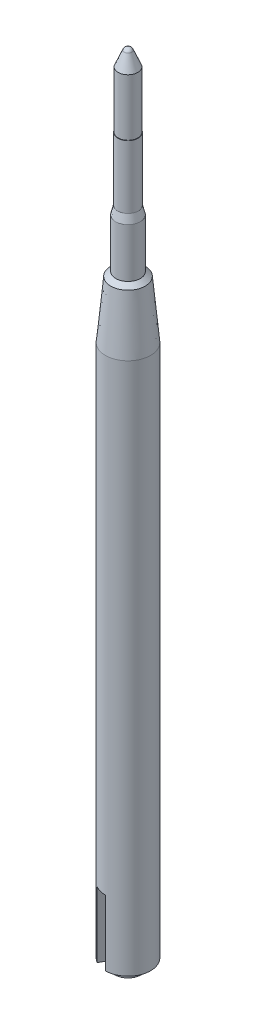
ISO-10303-21;
HEADER;
FILE_DESCRIPTION(('STEP AP214'),'2;1');
FILE_NAME('part.step','',(''),(''),'','','');
FILE_SCHEMA(('AUTOMOTIVE_DESIGN { 1 0 10303 214 1 1 1 1 }'));
ENDSEC;
DATA;
#1=APPLICATION_CONTEXT('core data for automotive mechanical design processes');
#2=APPLICATION_PROTOCOL_DEFINITION('international standard','automotive_design',2000,#1);
#3=PRODUCT_CONTEXT('',#1,'mechanical');
#4=PRODUCT('Part','Part','',(#3));
#5=PRODUCT_RELATED_PRODUCT_CATEGORY('part','',(#4));
#6=PRODUCT_DEFINITION_FORMATION('','',#4);
#7=PRODUCT_DEFINITION_CONTEXT('part definition',#1,'design');
#8=PRODUCT_DEFINITION('design','',#6,#7);
#9=PRODUCT_DEFINITION_SHAPE('','',#8);
#10=(LENGTH_UNIT() NAMED_UNIT(*) SI_UNIT(.MILLI.,.METRE.));
#11=(NAMED_UNIT(*) PLANE_ANGLE_UNIT() SI_UNIT($,.RADIAN.));
#12=(NAMED_UNIT(*) SI_UNIT($,.STERADIAN.) SOLID_ANGLE_UNIT());
#13=UNCERTAINTY_MEASURE_WITH_UNIT(LENGTH_MEASURE(1.E-05),#10,'distance_accuracy_value','');
#14=(GEOMETRIC_REPRESENTATION_CONTEXT(3) GLOBAL_UNCERTAINTY_ASSIGNED_CONTEXT((#13)) GLOBAL_UNIT_ASSIGNED_CONTEXT((#10,
#11,#12)) REPRESENTATION_CONTEXT('',''));
#15=CARTESIAN_POINT('',(0.,0.,0.));
#16=DIRECTION('',(0.,0.,1.));
#17=DIRECTION('',(1.,0.,0.));
#18=AXIS2_PLACEMENT_3D('',#15,#16,#17);
#19=CARTESIAN_POINT('',(2.75000000000001,-97.,0.));
#20=DIRECTION('',(0.,1.,0.));
#21=DIRECTION('',(0.,0.,1.));
#22=AXIS2_PLACEMENT_3D('',#19,#20,#21);
#23=PLANE('',#22);
#24=DIRECTION('',(0.,0.,1.));
#25=VECTOR('',#24,1.);
#26=CARTESIAN_POINT('',(0.,-97.,0.));
#27=LINE('',#26,#25);
#28=CARTESIAN_POINT('',(0.,-97.,1.6));
#29=VERTEX_POINT('',#28);
#30=CARTESIAN_POINT('',(0.,-97.,2.75000000000001));
#31=VERTEX_POINT('',#30);
#32=EDGE_CURVE('E65',#29,#31,#27,.T.);
#33=ORIENTED_EDGE('',*,*,#32,.F.);
#34=CARTESIAN_POINT('',(0.,-97.,0.));
#35=DIRECTION('',(0.,1.,0.));
#36=DIRECTION('',(0.,0.,1.));
#37=AXIS2_PLACEMENT_3D('',#34,#35,#36);
#38=CIRCLE('',#37,1.6);
#39=CARTESIAN_POINT('',(0.800000000000002,-97.,-1.3856406460551));
#40=VERTEX_POINT('',#39);
#41=EDGE_CURVE('E116',#29,#40,#38,.T.);
#42=ORIENTED_EDGE('',*,*,#41,.T.);
#43=DIRECTION('',(0.500000000000001,0.,-0.866025403784438));
#44=VECTOR('',#43,1.);
#45=CARTESIAN_POINT('',(0.687500000000005,-97.,-1.19078493020361));
#46=LINE('',#45,#44);
#47=CARTESIAN_POINT('',(1.375,-97.,-2.38156986040721));
#48=VERTEX_POINT('',#47);
#49=EDGE_CURVE('E157',#40,#48,#46,.T.);
#50=ORIENTED_EDGE('',*,*,#49,.T.);
#51=CARTESIAN_POINT('',(0.,-97.,0.));
#52=DIRECTION('',(0.,1.,0.));
#53=DIRECTION('',(0.,0.,1.));
#54=AXIS2_PLACEMENT_3D('',#51,#52,#53);
#55=CIRCLE('',#54,2.75000000000001);
#56=EDGE_CURVE('E188',#31,#48,#55,.T.);
#57=ORIENTED_EDGE('',*,*,#56,.F.);
#58=EDGE_LOOP('',(#33,#42,#50,#57));
#59=FACE_BOUND('',#58,.T.);
#60=ADVANCED_FACE('F41',(#59),#23,.F.);
#61=CARTESIAN_POINT('',(0.,4.01041666666667,0.));
#62=DIRECTION('',(0.,1.,0.));
#63=DIRECTION('',(0.,0.,1.));
#64=AXIS2_PLACEMENT_3D('',#61,#62,#63);
#65=CYLINDRICAL_SURFACE('',#64,1.25);
#66=CARTESIAN_POINT('',(0.,-9.79999999999999,0.));
#67=DIRECTION('',(0.,1.,0.));
#68=DIRECTION('',(0.,0.,1.));
#69=AXIS2_PLACEMENT_3D('',#66,#67,#68);
#70=CIRCLE('',#69,1.25);
#71=CARTESIAN_POINT('',(0.,-9.79999999999999,1.25));
#72=VERTEX_POINT('',#71);
#73=EDGE_CURVE('E211',#72,#72,#70,.T.);
#74=ORIENTED_EDGE('',*,*,#73,.F.);
#75=EDGE_LOOP('',(#74));
#76=FACE_BOUND('',#75,.T.);
#77=CARTESIAN_POINT('',(0.,-17.5,0.));
#78=DIRECTION('',(0.,1.,0.));
#79=DIRECTION('',(0.,0.,1.));
#80=AXIS2_PLACEMENT_3D('',#77,#78,#79);
#81=CIRCLE('',#80,1.25);
#82=CARTESIAN_POINT('',(0.,-17.5,1.25));
#83=VERTEX_POINT('',#82);
#84=EDGE_CURVE('E167',#83,#83,#81,.T.);
#85=ORIENTED_EDGE('',*,*,#84,.T.);
#86=EDGE_LOOP('',(#85));
#87=FACE_BOUND('',#86,.T.);
#88=ADVANCED_FACE('F43',(#76,#87),#65,.T.);
#89=CARTESIAN_POINT('',(1.2,-9.79999999999999,0.));
#90=DIRECTION('',(0.,-1.,0.));
#91=DIRECTION('',(0.,0.,-1.));
#92=AXIS2_PLACEMENT_3D('',#89,#90,#91);
#93=PLANE('',#92);
#94=CARTESIAN_POINT('',(0.,-9.79999999999999,0.));
#95=DIRECTION('',(0.,1.,0.));
#96=DIRECTION('',(0.,0.,1.));
#97=AXIS2_PLACEMENT_3D('',#94,#95,#96);
#98=CIRCLE('',#97,1.2);
#99=CARTESIAN_POINT('',(0.,-9.79999999999999,1.2));
#100=VERTEX_POINT('',#99);
#101=EDGE_CURVE('E207',#100,#100,#98,.T.);
#102=ORIENTED_EDGE('',*,*,#101,.F.);
#103=EDGE_LOOP('',(#102));
#104=FACE_BOUND('',#103,.T.);
#105=ORIENTED_EDGE('',*,*,#73,.T.);
#106=EDGE_LOOP('',(#105));
#107=FACE_BOUND('',#106,.T.);
#108=ADVANCED_FACE('F257',(#104,#107),#93,.F.);
#109=CARTESIAN_POINT('',(0.,4.01041666666667,0.));
#110=DIRECTION('',(0.,1.,0.));
#111=DIRECTION('',(0.,0.,1.));
#112=AXIS2_PLACEMENT_3D('',#109,#110,#111);
#113=CYLINDRICAL_SURFACE('',#112,1.2);
#114=CARTESIAN_POINT('',(0.,-2.88,0.));
#115=DIRECTION('',(0.,1.,0.));
#116=DIRECTION('',(0.,0.,1.));
#117=AXIS2_PLACEMENT_3D('',#114,#115,#116);
#118=CIRCLE('',#117,1.2);
#119=CARTESIAN_POINT('',(0.,-2.88,1.2));
#120=VERTEX_POINT('',#119);
#121=EDGE_CURVE('E203',#120,#120,#118,.T.);
#122=ORIENTED_EDGE('',*,*,#121,.F.);
#123=EDGE_LOOP('',(#122));
#124=FACE_BOUND('',#123,.T.);
#125=ORIENTED_EDGE('',*,*,#101,.T.);
#126=EDGE_LOOP('',(#125));
#127=FACE_BOUND('',#126,.T.);
#128=ADVANCED_FACE('F282',(#124,#127),#113,.T.);
#129=CARTESIAN_POINT('',(0.,-2.88,0.));
#130=DIRECTION('',(0.,-1.,0.));
#131=DIRECTION('',(0.,0.,-1.));
#132=AXIS2_PLACEMENT_3D('',#129,#130,#131);
#133=CONICAL_SURFACE('',#132,1.2,0.394791119699761);
#134=CARTESIAN_POINT('',(0.,-1.1076923076923,0.));
#135=DIRECTION('',(0.,1.,0.));
#136=DIRECTION('',(0.,0.,1.));
#137=AXIS2_PLACEMENT_3D('',#134,#135,#136);
#138=CIRCLE('',#137,0.461538461538461);
#139=CARTESIAN_POINT('',(0.,-1.1076923076923,0.461538461538461));
#140=VERTEX_POINT('',#139);
#141=EDGE_CURVE('E199',#140,#140,#138,.T.);
#142=ORIENTED_EDGE('',*,*,#141,.F.);
#143=EDGE_LOOP('',(#142));
#144=FACE_BOUND('',#143,.T.);
#145=ORIENTED_EDGE('',*,*,#121,.T.);
#146=EDGE_LOOP('',(#145));
#147=FACE_BOUND('',#146,.T.);
#148=ADVANCED_FACE('F278',(#144,#147),#133,.T.);
#149=CARTESIAN_POINT('',(0.,-1.3,0.));
#150=DIRECTION('',(0.,1.,0.));
#151=DIRECTION('',(1.,0.,0.));
#152=AXIS2_PLACEMENT_3D('',#149,#150,#151);
#153=SPHERICAL_SURFACE('',#152,0.499999999999999);
#154=ORIENTED_EDGE('',*,*,#141,.T.);
#155=EDGE_LOOP('',(#154));
#156=FACE_BOUND('',#155,.T.);
#157=ADVANCED_FACE('F272',(#156),#153,.T.);
#158=CARTESIAN_POINT('',(1.6,-98.,0.));
#159=DIRECTION('',(0.,1.,0.));
#160=DIRECTION('',(0.,0.,1.));
#161=AXIS2_PLACEMENT_3D('',#158,#159,#160);
#162=PLANE('',#161);
#163=CARTESIAN_POINT('',(0.,-98.,0.));
#164=DIRECTION('',(0.,1.,0.));
#165=DIRECTION('',(0.,0.,1.));
#166=AXIS2_PLACEMENT_3D('',#163,#164,#165);
#167=CIRCLE('',#166,1.6);
#168=CARTESIAN_POINT('',(0.,-98.,1.6));
#169=VERTEX_POINT('',#168);
#170=EDGE_CURVE('E195',#169,#169,#167,.T.);
#171=ORIENTED_EDGE('',*,*,#170,.F.);
#172=EDGE_LOOP('',(#171));
#173=FACE_BOUND('',#172,.T.);
#174=ADVANCED_FACE('F268',(#173),#162,.F.);
#175=CARTESIAN_POINT('',(0.,4.01041666666667,0.));
#176=DIRECTION('',(0.,1.,0.));
#177=DIRECTION('',(0.,0.,1.));
#178=AXIS2_PLACEMENT_3D('',#175,#176,#177);
#179=CYLINDRICAL_SURFACE('',#178,1.6);
#180=DIRECTION('',(0.,1.,0.));
#181=VECTOR('',#180,1.);
#182=CARTESIAN_POINT('',(-0.800000000000001,-89.,1.3856406460551));
#183=LINE('',#182,#181);
#184=CARTESIAN_POINT('',(-0.8,-97.,1.3856406460551));
#185=VERTEX_POINT('',#184);
#186=CARTESIAN_POINT('',(-0.800000000000001,-89.,1.3856406460551));
#187=VERTEX_POINT('',#186);
#188=EDGE_CURVE('E133',#185,#187,#183,.T.);
#189=ORIENTED_EDGE('',*,*,#188,.F.);
#190=CARTESIAN_POINT('',(0.,-97.,-1.6));
#191=VERTEX_POINT('',#190);
#192=EDGE_CURVE('E192',#191,#185,#38,.T.);
#193=ORIENTED_EDGE('',*,*,#192,.F.);
#194=DIRECTION('',(0.,-1.,0.));
#195=VECTOR('',#194,1.);
#196=CARTESIAN_POINT('',(0.,-89.,-1.6));
#197=LINE('',#196,#195);
#198=CARTESIAN_POINT('',(0.,-89.,-1.6));
#199=VERTEX_POINT('',#198);
#200=EDGE_CURVE('E143',#199,#191,#197,.T.);
#201=ORIENTED_EDGE('',*,*,#200,.F.);
#202=CARTESIAN_POINT('',(0.,-89.,0.));
#203=DIRECTION('',(0.,1.,0.));
#204=DIRECTION('',(0.,0.,1.));
#205=AXIS2_PLACEMENT_3D('',#202,#203,#204);
#206=CIRCLE('',#205,1.6);
#207=CARTESIAN_POINT('',(0.800000000000002,-89.,-1.3856406460551));
#208=VERTEX_POINT('',#207);
#209=EDGE_CURVE('E120',#208,#199,#206,.T.);
#210=ORIENTED_EDGE('',*,*,#209,.F.);
#211=DIRECTION('',(0.,-1.,0.));
#212=VECTOR('',#211,1.);
#213=CARTESIAN_POINT('',(0.800000000000002,-89.,-1.3856406460551));
#214=LINE('',#213,#212);
#215=EDGE_CURVE('E149',#208,#40,#214,.T.);
#216=ORIENTED_EDGE('',*,*,#215,.T.);
#217=ORIENTED_EDGE('',*,*,#41,.F.);
#218=DIRECTION('',(0.,1.,0.));
#219=VECTOR('',#218,1.);
#220=CARTESIAN_POINT('',(0.,-89.,1.6));
#221=LINE('',#220,#219);
#222=CARTESIAN_POINT('',(0.,-89.,1.6));
#223=VERTEX_POINT('',#222);
#224=EDGE_CURVE('E107',#29,#223,#221,.T.);
#225=ORIENTED_EDGE('',*,*,#224,.T.);
#226=CARTESIAN_POINT('',(0.,-89.,0.));
#227=DIRECTION('',(0.,1.,0.));
#228=DIRECTION('',(0.,0.,1.));
#229=AXIS2_PLACEMENT_3D('',#226,#227,#228);
#230=CIRCLE('',#229,1.6);
#231=EDGE_CURVE('E112',#187,#223,#230,.T.);
#232=ORIENTED_EDGE('',*,*,#231,.F.);
#233=EDGE_LOOP('',(#189,#193,#201,#210,#216,#217,#225,#232));
#234=FACE_BOUND('',#233,.T.);
#235=ORIENTED_EDGE('',*,*,#170,.T.);
#236=EDGE_LOOP('',(#235));
#237=FACE_BOUND('',#236,.T.);
#238=ADVANCED_FACE('F110',(#234,#237),#179,.T.);
#239=ORIENTED_EDGE('',*,*,#192,.T.);
#240=DIRECTION('',(-0.500000000000001,0.,0.866025403784438));
#241=VECTOR('',#240,1.);
#242=CARTESIAN_POINT('',(0.687500000000005,-97.,-1.19078493020361));
#243=LINE('',#242,#241);
#244=CARTESIAN_POINT('',(-1.375,-97.,2.38156986040721));
#245=VERTEX_POINT('',#244);
#246=EDGE_CURVE('E163',#185,#245,#243,.T.);
#247=ORIENTED_EDGE('',*,*,#246,.T.);
#248=CARTESIAN_POINT('',(0.,-97.,-2.75000000000001));
#249=VERTEX_POINT('',#248);
#250=EDGE_CURVE('E187',#249,#245,#55,.T.);
#251=ORIENTED_EDGE('',*,*,#250,.F.);
#252=DIRECTION('',(0.,0.,-1.));
#253=VECTOR('',#252,1.);
#254=CARTESIAN_POINT('',(0.,-97.,0.));
#255=LINE('',#254,#253);
#256=EDGE_CURVE('E57',#191,#249,#255,.T.);
#257=ORIENTED_EDGE('',*,*,#256,.F.);
#258=EDGE_LOOP('',(#239,#247,#251,#257));
#259=FACE_BOUND('',#258,.T.);
#260=ADVANCED_FACE('F237',(#259),#23,.F.);
#261=CARTESIAN_POINT('',(0.,4.01041666666667,0.));
#262=DIRECTION('',(0.,1.,0.));
#263=DIRECTION('',(0.,0.,1.));
#264=AXIS2_PLACEMENT_3D('',#261,#262,#263);
#265=CYLINDRICAL_SURFACE('',#264,2.75);
#266=CARTESIAN_POINT('',(0.,-32.,0.));
#267=DIRECTION('',(0.,1.,0.));
#268=DIRECTION('',(0.,0.,1.));
#269=AXIS2_PLACEMENT_3D('',#266,#267,#268);
#270=CIRCLE('',#269,2.75);
#271=CARTESIAN_POINT('',(0.,-32.,2.75));
#272=VERTEX_POINT('',#271);
#273=EDGE_CURVE('E183',#272,#272,#270,.T.);
#274=ORIENTED_EDGE('',*,*,#273,.F.);
#275=EDGE_LOOP('',(#274));
#276=FACE_BOUND('',#275,.T.);
#277=ORIENTED_EDGE('',*,*,#250,.T.);
#278=DIRECTION('',(0.,1.,0.));
#279=VECTOR('',#278,1.);
#280=CARTESIAN_POINT('',(-1.375,4.01041666666667,2.38156986040721));
#281=LINE('',#280,#279);
#282=CARTESIAN_POINT('',(-1.375,-89.,2.38156986040721));
#283=VERTEX_POINT('',#282);
#284=EDGE_CURVE('E11',#245,#283,#281,.T.);
#285=ORIENTED_EDGE('',*,*,#284,.T.);
#286=CARTESIAN_POINT('',(0.,-89.,0.));
#287=DIRECTION('',(0.,1.,0.));
#288=DIRECTION('',(0.,0.,1.));
#289=AXIS2_PLACEMENT_3D('',#286,#287,#288);
#290=CIRCLE('',#289,2.75);
#291=CARTESIAN_POINT('',(0.,-89.,2.75));
#292=VERTEX_POINT('',#291);
#293=EDGE_CURVE('E50',#283,#292,#290,.T.);
#294=ORIENTED_EDGE('',*,*,#293,.T.);
#295=DIRECTION('',(0.,1.,0.));
#296=VECTOR('',#295,1.);
#297=CARTESIAN_POINT('',(0.,4.01041666666667,2.75));
#298=LINE('',#297,#296);
#299=EDGE_CURVE('E131',#31,#292,#298,.T.);
#300=ORIENTED_EDGE('',*,*,#299,.F.);
#301=ORIENTED_EDGE('',*,*,#56,.T.);
#302=DIRECTION('',(0.,1.,0.));
#303=VECTOR('',#302,1.);
#304=CARTESIAN_POINT('',(1.375,4.01041666666667,-2.38156986040721));
#305=LINE('',#304,#303);
#306=CARTESIAN_POINT('',(1.375,-89.,-2.38156986040721));
#307=VERTEX_POINT('',#306);
#308=EDGE_CURVE('E221',#48,#307,#305,.T.);
#309=ORIENTED_EDGE('',*,*,#308,.T.);
#310=CARTESIAN_POINT('',(0.,-89.,0.));
#311=DIRECTION('',(0.,-1.,0.));
#312=DIRECTION('',(0.,0.,-1.));
#313=AXIS2_PLACEMENT_3D('',#310,#311,#312);
#314=CIRCLE('',#313,2.75);
#315=CARTESIAN_POINT('',(0.,-89.,-2.75));
#316=VERTEX_POINT('',#315);
#317=EDGE_CURVE('E218',#316,#307,#314,.T.);
#318=ORIENTED_EDGE('',*,*,#317,.F.);
#319=DIRECTION('',(0.,1.,0.));
#320=VECTOR('',#319,1.);
#321=CARTESIAN_POINT('',(0.,4.01041666666667,-2.75));
#322=LINE('',#321,#320);
#323=EDGE_CURVE('E215',#249,#316,#322,.T.);
#324=ORIENTED_EDGE('',*,*,#323,.F.);
#325=EDGE_LOOP('',(#277,#285,#294,#300,#301,#309,#318,#324));
#326=FACE_BOUND('',#325,.T.);
#327=ADVANCED_FACE('F229',(#276,#326),#265,.T.);
#328=CARTESIAN_POINT('',(0.,-32.,0.));
#329=DIRECTION('',(0.,-1.,0.));
#330=DIRECTION('',(0.,0.,-1.));
#331=AXIS2_PLACEMENT_3D('',#328,#329,#330);
#332=CONICAL_SURFACE('',#331,2.75,0.092591629807551);
#333=CARTESIAN_POINT('',(0.,-25.,0.));
#334=DIRECTION('',(0.,1.,0.));
#335=DIRECTION('',(0.,0.,1.));
#336=AXIS2_PLACEMENT_3D('',#333,#334,#335);
#337=CIRCLE('',#336,2.1);
#338=CARTESIAN_POINT('',(0.,-25.,2.1));
#339=VERTEX_POINT('',#338);
#340=EDGE_CURVE('E179',#339,#339,#337,.T.);
#341=ORIENTED_EDGE('',*,*,#340,.F.);
#342=EDGE_LOOP('',(#341));
#343=FACE_BOUND('',#342,.T.);
#344=ORIENTED_EDGE('',*,*,#273,.T.);
#345=EDGE_LOOP('',(#344));
#346=FACE_BOUND('',#345,.T.);
#347=ADVANCED_FACE('F266',(#343,#346),#332,.T.);
#348=CARTESIAN_POINT('',(0.,-25.,0.));
#349=DIRECTION('',(0.,-1.,0.));
#350=DIRECTION('',(0.,0.,-1.));
#351=AXIS2_PLACEMENT_3D('',#348,#349,#350);
#352=CONICAL_SURFACE('',#351,2.1,0.876058050598193);
#353=CARTESIAN_POINT('',(0.,-24.5,0.));
#354=DIRECTION('',(0.,1.,0.));
#355=DIRECTION('',(0.,0.,1.));
#356=AXIS2_PLACEMENT_3D('',#353,#354,#355);
#357=CIRCLE('',#356,1.5);
#358=CARTESIAN_POINT('',(0.,-24.5,1.5));
#359=VERTEX_POINT('',#358);
#360=EDGE_CURVE('E175',#359,#359,#357,.T.);
#361=ORIENTED_EDGE('',*,*,#360,.F.);
#362=EDGE_LOOP('',(#361));
#363=FACE_BOUND('',#362,.T.);
#364=ORIENTED_EDGE('',*,*,#340,.T.);
#365=EDGE_LOOP('',(#364));
#366=FACE_BOUND('',#365,.T.);
#367=ADVANCED_FACE('F305',(#363,#366),#352,.T.);
#368=CARTESIAN_POINT('',(0.,4.01041666666667,0.));
#369=DIRECTION('',(0.,1.,0.));
#370=DIRECTION('',(0.,0.,1.));
#371=AXIS2_PLACEMENT_3D('',#368,#369,#370);
#372=CYLINDRICAL_SURFACE('',#371,1.5);
#373=CARTESIAN_POINT('',(0.,-18.5,0.));
#374=DIRECTION('',(0.,1.,0.));
#375=DIRECTION('',(0.,0.,1.));
#376=AXIS2_PLACEMENT_3D('',#373,#374,#375);
#377=CIRCLE('',#376,1.5);
#378=CARTESIAN_POINT('',(0.,-18.5,1.5));
#379=VERTEX_POINT('',#378);
#380=EDGE_CURVE('E171',#379,#379,#377,.T.);
#381=ORIENTED_EDGE('',*,*,#380,.F.);
#382=EDGE_LOOP('',(#381));
#383=FACE_BOUND('',#382,.T.);
#384=ORIENTED_EDGE('',*,*,#360,.T.);
#385=EDGE_LOOP('',(#384));
#386=FACE_BOUND('',#385,.T.);
#387=ADVANCED_FACE('F299',(#383,#386),#372,.T.);
#388=CARTESIAN_POINT('',(0.,-18.5,0.));
#389=DIRECTION('',(0.,-1.,0.));
#390=DIRECTION('',(0.,0.,-1.));
#391=AXIS2_PLACEMENT_3D('',#388,#389,#390);
#392=CONICAL_SURFACE('',#391,1.5,0.244978663126862);
#393=ORIENTED_EDGE('',*,*,#84,.F.);
#394=EDGE_LOOP('',(#393));
#395=FACE_BOUND('',#394,.T.);
#396=ORIENTED_EDGE('',*,*,#380,.T.);
#397=EDGE_LOOP('',(#396));
#398=FACE_BOUND('',#397,.T.);
#399=ADVANCED_FACE('F296',(#395,#398),#392,.T.);
#400=CARTESIAN_POINT('',(0.800000000000002,-89.,-1.3856406460551));
#401=DIRECTION('',(0.,-1.,0.));
#402=DIRECTION('',(0.,0.,-1.));
#403=AXIS2_PLACEMENT_3D('',#400,#401,#402);
#404=PLANE('',#403);
#405=ORIENTED_EDGE('',*,*,#317,.T.);
#406=DIRECTION('',(-0.500000000000001,0.,0.866025403784438));
#407=VECTOR('',#406,1.);
#408=CARTESIAN_POINT('',(0.800000000000002,-89.,-1.3856406460551));
#409=LINE('',#408,#407);
#410=EDGE_CURVE('E146',#307,#208,#409,.T.);
#411=ORIENTED_EDGE('',*,*,#410,.T.);
#412=ORIENTED_EDGE('',*,*,#209,.T.);
#413=DIRECTION('',(0.,0.,1.));
#414=VECTOR('',#413,1.);
#415=CARTESIAN_POINT('',(0.,-89.,-1.6));
#416=LINE('',#415,#414);
#417=EDGE_CURVE('E140',#316,#199,#416,.T.);
#418=ORIENTED_EDGE('',*,*,#417,.F.);
#419=EDGE_LOOP('',(#405,#411,#412,#418));
#420=FACE_BOUND('',#419,.T.);
#421=ADVANCED_FACE('F245',(#420),#404,.T.);
#422=CARTESIAN_POINT('',(0.,0.,0.));
#423=DIRECTION('',(0.866025403784438,0.,0.500000000000001));
#424=DIRECTION('',(0.500000000000001,0.,-0.866025403784438));
#425=AXIS2_PLACEMENT_3D('',#422,#423,#424);
#426=PLANE('',#425);
#427=ORIENTED_EDGE('',*,*,#215,.F.);
#428=ORIENTED_EDGE('',*,*,#410,.F.);
#429=ORIENTED_EDGE('',*,*,#308,.F.);
#430=ORIENTED_EDGE('',*,*,#49,.F.);
#431=EDGE_LOOP('',(#427,#428,#429,#430));
#432=FACE_BOUND('',#431,.T.);
#433=ADVANCED_FACE('F250',(#432),#426,.F.);
#434=CARTESIAN_POINT('',(0.,0.,0.));
#435=DIRECTION('',(1.,0.,0.));
#436=DIRECTION('',(0.,0.,-1.));
#437=AXIS2_PLACEMENT_3D('',#434,#435,#436);
#438=PLANE('',#437);
#439=ORIENTED_EDGE('',*,*,#256,.T.);
#440=ORIENTED_EDGE('',*,*,#323,.T.);
#441=ORIENTED_EDGE('',*,*,#417,.T.);
#442=ORIENTED_EDGE('',*,*,#200,.T.);
#443=EDGE_LOOP('',(#439,#440,#441,#442));
#444=FACE_BOUND('',#443,.T.);
#445=ADVANCED_FACE('F243',(#444),#438,.T.);
#446=CARTESIAN_POINT('',(-0.800000000000001,-89.,1.3856406460551));
#447=DIRECTION('',(0.,1.,0.));
#448=DIRECTION('',(0.,0.,1.));
#449=AXIS2_PLACEMENT_3D('',#446,#447,#448);
#450=PLANE('',#449);
#451=DIRECTION('',(-0.500000000000001,0.,0.866025403784438));
#452=VECTOR('',#451,1.);
#453=CARTESIAN_POINT('',(-0.800000000000001,-89.,1.3856406460551));
#454=LINE('',#453,#452);
#455=EDGE_CURVE('E127',#187,#283,#454,.T.);
#456=ORIENTED_EDGE('',*,*,#455,.F.);
#457=ORIENTED_EDGE('',*,*,#231,.T.);
#458=DIRECTION('',(0.,0.,1.));
#459=VECTOR('',#458,1.);
#460=CARTESIAN_POINT('',(0.,-89.,1.6));
#461=LINE('',#460,#459);
#462=EDGE_CURVE('E119',#223,#292,#461,.T.);
#463=ORIENTED_EDGE('',*,*,#462,.T.);
#464=ORIENTED_EDGE('',*,*,#293,.F.);
#465=EDGE_LOOP('',(#456,#457,#463,#464));
#466=FACE_BOUND('',#465,.T.);
#467=ADVANCED_FACE('F124',(#466),#450,.F.);
#468=CARTESIAN_POINT('',(0.,0.,0.));
#469=DIRECTION('',(-0.866025403784438,0.,-0.500000000000001));
#470=DIRECTION('',(-0.500000000000001,0.,0.866025403784438));
#471=AXIS2_PLACEMENT_3D('',#468,#469,#470);
#472=PLANE('',#471);
#473=ORIENTED_EDGE('',*,*,#188,.T.);
#474=ORIENTED_EDGE('',*,*,#455,.T.);
#475=ORIENTED_EDGE('',*,*,#284,.F.);
#476=ORIENTED_EDGE('',*,*,#246,.F.);
#477=EDGE_LOOP('',(#473,#474,#475,#476));
#478=FACE_BOUND('',#477,.T.);
#479=ADVANCED_FACE('F232',(#478),#472,.F.);
#480=CARTESIAN_POINT('',(0.,0.,0.));
#481=DIRECTION('',(-1.,0.,0.));
#482=DIRECTION('',(0.,0.,1.));
#483=AXIS2_PLACEMENT_3D('',#480,#481,#482);
#484=PLANE('',#483);
#485=ORIENTED_EDGE('',*,*,#32,.T.);
#486=ORIENTED_EDGE('',*,*,#299,.T.);
#487=ORIENTED_EDGE('',*,*,#462,.F.);
#488=ORIENTED_EDGE('',*,*,#224,.F.);
#489=EDGE_LOOP('',(#485,#486,#487,#488));
#490=FACE_BOUND('',#489,.T.);
#491=ADVANCED_FACE('F130',(#490),#484,.T.);
#492=CLOSED_SHELL('',(#60,#88,#108,#128,#148,#157,#174,#238,#260,#327,#347,#367,#387,#399,#421,
#433,#445,#467,#479,#491));
#493=MANIFOLD_SOLID_BREP('B2',#492);
#494=ADVANCED_BREP_SHAPE_REPRESENTATION('',(#18,#493),#14);
#495=SHAPE_DEFINITION_REPRESENTATION(#9,#494);
ENDSEC;
END-ISO-10303-21;
